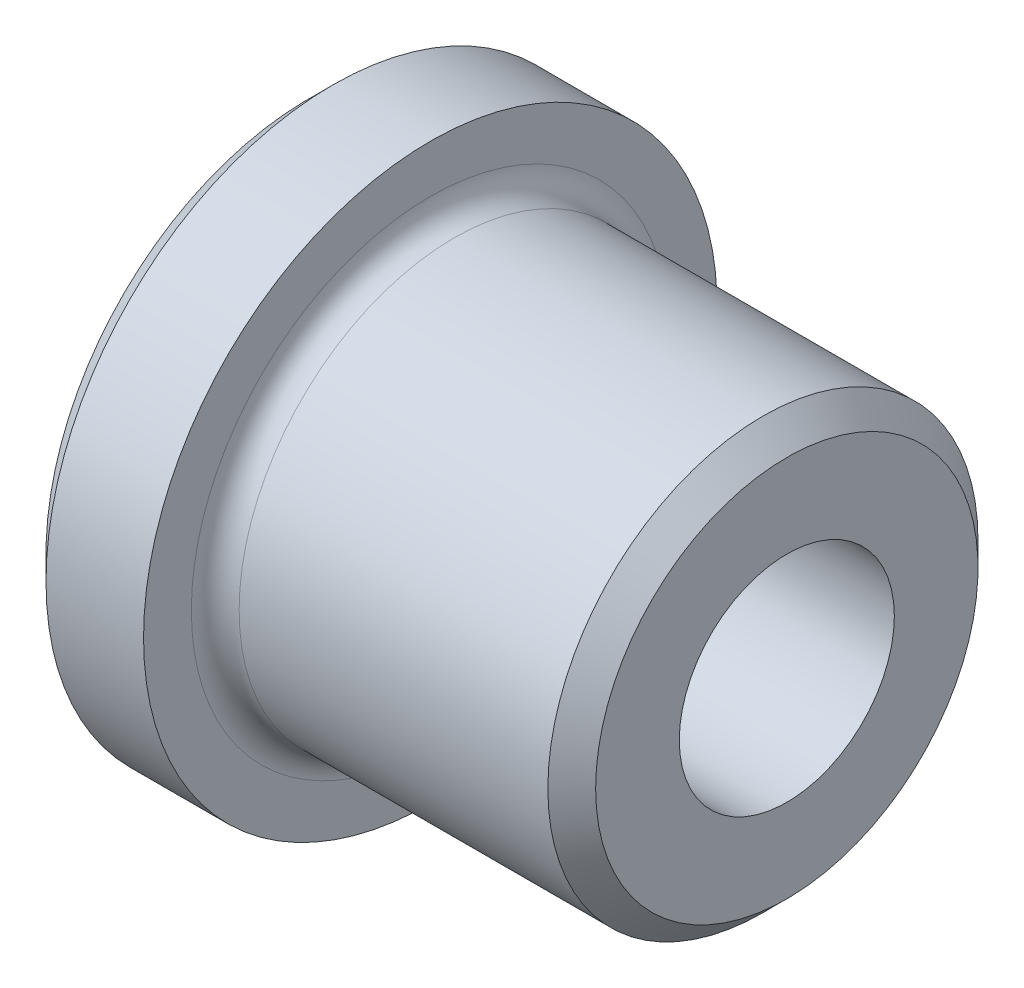
ISO-10303-21;
HEADER;
FILE_DESCRIPTION(('STEP AP214'),'2;1');
FILE_NAME('part.step','',(''),(''),'','','');
FILE_SCHEMA(('AUTOMOTIVE_DESIGN { 1 0 10303 214 1 1 1 1 }'));
ENDSEC;
DATA;
#1=APPLICATION_CONTEXT('core data for automotive mechanical design processes');
#2=APPLICATION_PROTOCOL_DEFINITION('international standard','automotive_design',2000,#1);
#3=PRODUCT_CONTEXT('',#1,'mechanical');
#4=PRODUCT('Part','Part','',(#3));
#5=PRODUCT_RELATED_PRODUCT_CATEGORY('part','',(#4));
#6=PRODUCT_DEFINITION_FORMATION('','',#4);
#7=PRODUCT_DEFINITION_CONTEXT('part definition',#1,'design');
#8=PRODUCT_DEFINITION('design','',#6,#7);
#9=PRODUCT_DEFINITION_SHAPE('','',#8);
#10=(LENGTH_UNIT() NAMED_UNIT(*) SI_UNIT(.MILLI.,.METRE.));
#11=(NAMED_UNIT(*) PLANE_ANGLE_UNIT() SI_UNIT($,.RADIAN.));
#12=(NAMED_UNIT(*) SI_UNIT($,.STERADIAN.) SOLID_ANGLE_UNIT());
#13=UNCERTAINTY_MEASURE_WITH_UNIT(LENGTH_MEASURE(1.E-05),#10,'distance_accuracy_value','');
#14=(GEOMETRIC_REPRESENTATION_CONTEXT(3) GLOBAL_UNCERTAINTY_ASSIGNED_CONTEXT((#13)) GLOBAL_UNIT_ASSIGNED_CONTEXT((#10,
#11,#12)) REPRESENTATION_CONTEXT('',''));
#15=CARTESIAN_POINT('',(0.,0.,0.));
#16=DIRECTION('',(0.,0.,1.));
#17=DIRECTION('',(1.,0.,0.));
#18=AXIS2_PLACEMENT_3D('',#15,#16,#17);
#19=CARTESIAN_POINT('',(-1.74348654821331,0.,0.));
#20=DIRECTION('',(-1.,0.,0.));
#21=DIRECTION('',(0.,0.,1.));
#22=AXIS2_PLACEMENT_3D('',#19,#20,#21);
#23=CYLINDRICAL_SURFACE('',#22,2.25);
#24=CARTESIAN_POINT('',(10.,0.,0.));
#25=DIRECTION('',(-1.,0.,0.));
#26=DIRECTION('',(0.,0.,1.));
#27=AXIS2_PLACEMENT_3D('',#24,#25,#26);
#28=CIRCLE('',#27,2.25);
#29=CARTESIAN_POINT('',(10.,0.,2.25));
#30=VERTEX_POINT('',#29);
#31=EDGE_CURVE('E72',#30,#30,#28,.T.);
#32=ORIENTED_EDGE('',*,*,#31,.F.);
#33=EDGE_LOOP('',(#32));
#34=FACE_BOUND('',#33,.T.);
#35=CARTESIAN_POINT('',(0.,0.,0.));
#36=DIRECTION('',(-1.,0.,0.));
#37=DIRECTION('',(0.,0.,1.));
#38=AXIS2_PLACEMENT_3D('',#35,#36,#37);
#39=CIRCLE('',#38,2.25);
#40=CARTESIAN_POINT('',(0.,0.,2.25));
#41=VERTEX_POINT('',#40);
#42=EDGE_CURVE('E63',#41,#41,#39,.T.);
#43=ORIENTED_EDGE('',*,*,#42,.T.);
#44=EDGE_LOOP('',(#43));
#45=FACE_BOUND('',#44,.T.);
#46=ADVANCED_FACE('F39',(#34,#45),#23,.F.);
#47=CARTESIAN_POINT('',(0.,2.25,0.));
#48=DIRECTION('',(1.,0.,0.));
#49=DIRECTION('',(0.,0.,-1.));
#50=AXIS2_PLACEMENT_3D('',#47,#48,#49);
#51=PLANE('',#50);
#52=CARTESIAN_POINT('',(0.,0.,0.));
#53=DIRECTION('',(1.,0.,0.));
#54=DIRECTION('',(0.,0.,-1.));
#55=AXIS2_PLACEMENT_3D('',#52,#53,#54);
#56=CIRCLE('',#55,5.5);
#57=CARTESIAN_POINT('',(0.,0.,-5.5));
#58=VERTEX_POINT('',#57);
#59=EDGE_CURVE('E53',#58,#58,#56,.F.);
#60=ORIENTED_EDGE('',*,*,#59,.T.);
#61=EDGE_LOOP('',(#60));
#62=FACE_BOUND('',#61,.T.);
#63=ORIENTED_EDGE('',*,*,#42,.F.);
#64=EDGE_LOOP('',(#63));
#65=FACE_BOUND('',#64,.T.);
#66=ADVANCED_FACE('F76',(#62,#65),#51,.F.);
#67=CARTESIAN_POINT('',(-1.74348654821331,0.,0.));
#68=DIRECTION('',(-1.,0.,0.));
#69=DIRECTION('',(0.,0.,1.));
#70=AXIS2_PLACEMENT_3D('',#67,#68,#69);
#71=CYLINDRICAL_SURFACE('',#70,6.);
#72=CARTESIAN_POINT('',(0.500000000000001,0.,0.));
#73=DIRECTION('',(1.,0.,0.));
#74=DIRECTION('',(0.,0.,-1.));
#75=AXIS2_PLACEMENT_3D('',#72,#73,#74);
#76=CIRCLE('',#75,6.);
#77=CARTESIAN_POINT('',(0.500000000000001,0.,-6.));
#78=VERTEX_POINT('',#77);
#79=EDGE_CURVE('E49',#78,#78,#76,.T.);
#80=ORIENTED_EDGE('',*,*,#79,.T.);
#81=EDGE_LOOP('',(#80));
#82=FACE_BOUND('',#81,.T.);
#83=CARTESIAN_POINT('',(2.54071661237785,0.,0.));
#84=DIRECTION('',(-1.,0.,0.));
#85=DIRECTION('',(0.,0.,1.));
#86=AXIS2_PLACEMENT_3D('',#83,#84,#85);
#87=CIRCLE('',#86,6.);
#88=CARTESIAN_POINT('',(2.54071661237785,0.,6.));
#89=VERTEX_POINT('',#88);
#90=EDGE_CURVE('E70',#89,#89,#87,.T.);
#91=ORIENTED_EDGE('',*,*,#90,.T.);
#92=EDGE_LOOP('',(#91));
#93=FACE_BOUND('',#92,.T.);
#94=ADVANCED_FACE('F81',(#82,#93),#71,.T.);
#95=CARTESIAN_POINT('',(2.54071661237785,6.,0.));
#96=DIRECTION('',(-1.,0.,0.));
#97=DIRECTION('',(0.,0.,1.));
#98=AXIS2_PLACEMENT_3D('',#95,#96,#97);
#99=PLANE('',#98);
#100=CARTESIAN_POINT('',(2.54071661237785,0.,0.));
#101=DIRECTION('',(-1.,0.,0.));
#102=DIRECTION('',(0.,0.,1.));
#103=AXIS2_PLACEMENT_3D('',#100,#101,#102);
#104=CIRCLE('',#103,5.);
#105=CARTESIAN_POINT('',(2.54071661237785,0.,5.));
#106=VERTEX_POINT('',#105);
#107=EDGE_CURVE('E46',#106,#106,#104,.T.);
#108=ORIENTED_EDGE('',*,*,#107,.T.);
#109=EDGE_LOOP('',(#108));
#110=FACE_BOUND('',#109,.T.);
#111=ORIENTED_EDGE('',*,*,#90,.F.);
#112=EDGE_LOOP('',(#111));
#113=FACE_BOUND('',#112,.T.);
#114=ADVANCED_FACE('F89',(#110,#113),#99,.F.);
#115=CARTESIAN_POINT('',(-1.74348654821331,0.,0.));
#116=DIRECTION('',(-1.,0.,0.));
#117=DIRECTION('',(0.,0.,1.));
#118=AXIS2_PLACEMENT_3D('',#115,#116,#117);
#119=CYLINDRICAL_SURFACE('',#118,4.5);
#120=CARTESIAN_POINT('',(3.04071661237785,0.,0.));
#121=DIRECTION('',(-1.,0.,0.));
#122=DIRECTION('',(0.,0.,1.));
#123=AXIS2_PLACEMENT_3D('',#120,#121,#122);
#124=CIRCLE('',#123,4.5);
#125=CARTESIAN_POINT('',(3.04071661237785,0.,4.5));
#126=VERTEX_POINT('',#125);
#127=EDGE_CURVE('E10',#126,#126,#124,.F.);
#128=ORIENTED_EDGE('',*,*,#127,.T.);
#129=EDGE_LOOP('',(#128));
#130=FACE_BOUND('',#129,.T.);
#131=CARTESIAN_POINT('',(9.5,0.,0.));
#132=DIRECTION('',(-1.,0.,0.));
#133=DIRECTION('',(0.,0.,1.));
#134=AXIS2_PLACEMENT_3D('',#131,#132,#133);
#135=CIRCLE('',#134,4.5);
#136=CARTESIAN_POINT('',(9.5,0.,4.5));
#137=VERTEX_POINT('',#136);
#138=EDGE_CURVE('E65',#137,#137,#135,.T.);
#139=ORIENTED_EDGE('',*,*,#138,.T.);
#140=EDGE_LOOP('',(#139));
#141=FACE_BOUND('',#140,.T.);
#142=ADVANCED_FACE('F119',(#130,#141),#119,.T.);
#143=CARTESIAN_POINT('',(10.,4.5,0.));
#144=DIRECTION('',(-1.,0.,0.));
#145=DIRECTION('',(0.,0.,1.));
#146=AXIS2_PLACEMENT_3D('',#143,#144,#145);
#147=PLANE('',#146);
#148=CARTESIAN_POINT('',(10.,0.,0.));
#149=DIRECTION('',(-1.,0.,0.));
#150=DIRECTION('',(0.,0.,1.));
#151=AXIS2_PLACEMENT_3D('',#148,#149,#150);
#152=CIRCLE('',#151,4.);
#153=CARTESIAN_POINT('',(10.,0.,4.));
#154=VERTEX_POINT('',#153);
#155=EDGE_CURVE('E56',#154,#154,#152,.F.);
#156=ORIENTED_EDGE('',*,*,#155,.T.);
#157=EDGE_LOOP('',(#156));
#158=FACE_BOUND('',#157,.T.);
#159=ORIENTED_EDGE('',*,*,#31,.T.);
#160=EDGE_LOOP('',(#159));
#161=FACE_BOUND('',#160,.T.);
#162=ADVANCED_FACE('F73',(#158,#161),#147,.F.);
#163=CARTESIAN_POINT('',(9.5,0.,0.));
#164=DIRECTION('',(-1.,0.,0.));
#165=DIRECTION('',(0.,0.,1.));
#166=AXIS2_PLACEMENT_3D('',#163,#164,#165);
#167=CONICAL_SURFACE('',#166,4.5,0.785398163397449);
#168=ORIENTED_EDGE('',*,*,#155,.F.);
#169=EDGE_LOOP('',(#168));
#170=FACE_BOUND('',#169,.T.);
#171=ORIENTED_EDGE('',*,*,#138,.F.);
#172=EDGE_LOOP('',(#171));
#173=FACE_BOUND('',#172,.T.);
#174=ADVANCED_FACE('F96',(#170,#173),#167,.T.);
#175=CARTESIAN_POINT('',(0.,0.,0.));
#176=DIRECTION('',(1.,0.,0.));
#177=DIRECTION('',(0.,0.,-1.));
#178=AXIS2_PLACEMENT_3D('',#175,#176,#177);
#179=CONICAL_SURFACE('',#178,5.5,0.785398163397448);
#180=ORIENTED_EDGE('',*,*,#79,.F.);
#181=EDGE_LOOP('',(#180));
#182=FACE_BOUND('',#181,.T.);
#183=ORIENTED_EDGE('',*,*,#59,.F.);
#184=EDGE_LOOP('',(#183));
#185=FACE_BOUND('',#184,.T.);
#186=ADVANCED_FACE('F101',(#182,#185),#179,.T.);
#187=CARTESIAN_POINT('',(3.04071661237785,0.,0.));
#188=DIRECTION('',(-1.,0.,0.));
#189=DIRECTION('',(0.,0.,1.));
#190=AXIS2_PLACEMENT_3D('',#187,#188,#189);
#191=TOROIDAL_SURFACE('',#190,5.,0.5);
#192=ORIENTED_EDGE('',*,*,#127,.F.);
#193=EDGE_LOOP('',(#192));
#194=FACE_BOUND('',#193,.T.);
#195=ORIENTED_EDGE('',*,*,#107,.F.);
#196=EDGE_LOOP('',(#195));
#197=FACE_BOUND('',#196,.T.);
#198=ADVANCED_FACE('F41',(#194,#197),#191,.F.);
#199=CLOSED_SHELL('',(#46,#66,#94,#114,#142,#162,#174,#186,#198));
#200=MANIFOLD_SOLID_BREP('B2',#199);
#201=ADVANCED_BREP_SHAPE_REPRESENTATION('',(#18,#200),#14);
#202=SHAPE_DEFINITION_REPRESENTATION(#9,#201);
ENDSEC;
END-ISO-10303-21;
